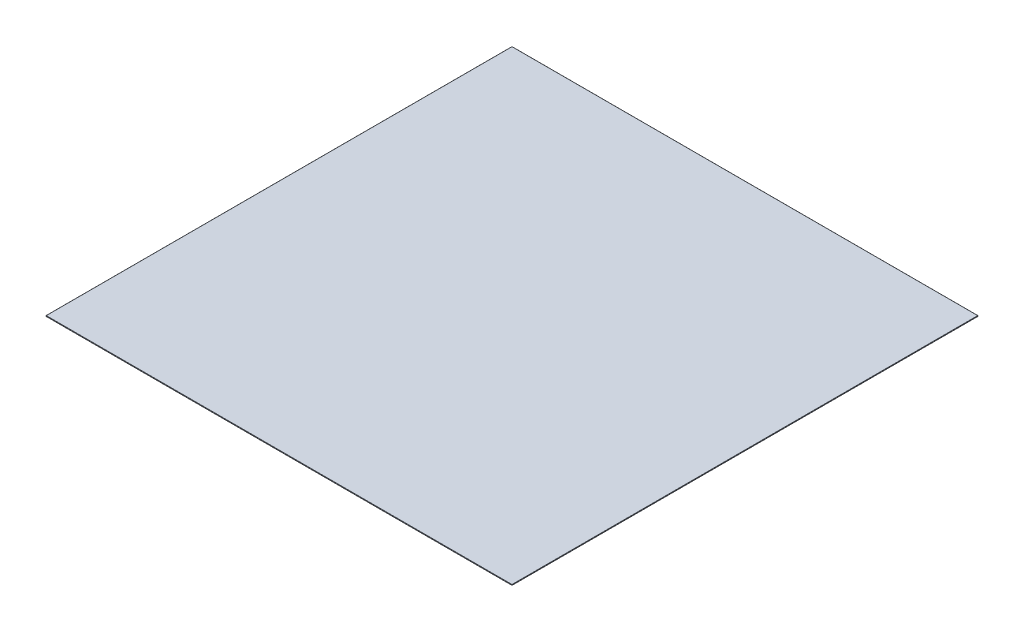
ISO-10303-21;
HEADER;
FILE_DESCRIPTION(('STEP AP214'),'2;1');
FILE_NAME('part.step','',(''),(''),'','','');
FILE_SCHEMA(('AUTOMOTIVE_DESIGN { 1 0 10303 214 1 1 1 1 }'));
ENDSEC;
DATA;
#1=APPLICATION_CONTEXT('core data for automotive mechanical design processes');
#2=APPLICATION_PROTOCOL_DEFINITION('international standard','automotive_design',2000,#1);
#3=PRODUCT_CONTEXT('',#1,'mechanical');
#4=PRODUCT('Part','Part','',(#3));
#5=PRODUCT_RELATED_PRODUCT_CATEGORY('part','',(#4));
#6=PRODUCT_DEFINITION_FORMATION('','',#4);
#7=PRODUCT_DEFINITION_CONTEXT('part definition',#1,'design');
#8=PRODUCT_DEFINITION('design','',#6,#7);
#9=PRODUCT_DEFINITION_SHAPE('','',#8);
#10=(LENGTH_UNIT() NAMED_UNIT(*) SI_UNIT(.MILLI.,.METRE.));
#11=(NAMED_UNIT(*) PLANE_ANGLE_UNIT() SI_UNIT($,.RADIAN.));
#12=(NAMED_UNIT(*) SI_UNIT($,.STERADIAN.) SOLID_ANGLE_UNIT());
#13=UNCERTAINTY_MEASURE_WITH_UNIT(LENGTH_MEASURE(1.E-05),#10,'distance_accuracy_value','');
#14=(GEOMETRIC_REPRESENTATION_CONTEXT(3) GLOBAL_UNCERTAINTY_ASSIGNED_CONTEXT((#13)) GLOBAL_UNIT_ASSIGNED_CONTEXT((#10,
#11,#12)) REPRESENTATION_CONTEXT('',''));
#15=CARTESIAN_POINT('',(0.,0.,0.));
#16=DIRECTION('',(0.,0.,1.));
#17=DIRECTION('',(1.,0.,0.));
#18=AXIS2_PLACEMENT_3D('',#15,#16,#17);
#19=CARTESIAN_POINT('',(0.,3.175,0.));
#20=DIRECTION('',(1.,0.,0.));
#21=DIRECTION('',(0.,0.,-1.));
#22=AXIS2_PLACEMENT_3D('',#19,#20,#21);
#23=PLANE('',#22);
#24=DIRECTION('',(0.,-1.,0.));
#25=VECTOR('',#24,1.);
#26=CARTESIAN_POINT('',(0.,3.175,1999.));
#27=LINE('',#26,#25);
#28=CARTESIAN_POINT('',(0.,1.,1999.));
#29=VERTEX_POINT('',#28);
#30=CARTESIAN_POINT('',(0.,2.175,1999.));
#31=VERTEX_POINT('',#30);
#32=EDGE_CURVE('E133',#29,#31,#27,.F.);
#33=ORIENTED_EDGE('',*,*,#32,.T.);
#34=DIRECTION('',(0.,0.,1.));
#35=VECTOR('',#34,1.);
#36=CARTESIAN_POINT('',(0.,2.175,0.));
#37=LINE('',#36,#35);
#38=CARTESIAN_POINT('',(0.,2.175,1.));
#39=VERTEX_POINT('',#38);
#40=EDGE_CURVE('E170',#31,#39,#37,.F.);
#41=ORIENTED_EDGE('',*,*,#40,.T.);
#42=DIRECTION('',(0.,-1.,0.));
#43=VECTOR('',#42,1.);
#44=CARTESIAN_POINT('',(0.,3.175,1.));
#45=LINE('',#44,#43);
#46=CARTESIAN_POINT('',(0.,1.,1.));
#47=VERTEX_POINT('',#46);
#48=EDGE_CURVE('E167',#39,#47,#45,.T.);
#49=ORIENTED_EDGE('',*,*,#48,.T.);
#50=DIRECTION('',(0.,0.,1.));
#51=VECTOR('',#50,1.);
#52=CARTESIAN_POINT('',(0.,1.,0.));
#53=LINE('',#52,#51);
#54=EDGE_CURVE('E162',#47,#29,#53,.T.);
#55=ORIENTED_EDGE('',*,*,#54,.T.);
#56=EDGE_LOOP('',(#33,#41,#49,#55));
#57=FACE_BOUND('',#56,.T.);
#58=ADVANCED_FACE('F37',(#57),#23,.F.);
#59=CARTESIAN_POINT('',(0.,3.175,2000.));
#60=DIRECTION('',(0.,0.,-1.));
#61=DIRECTION('',(-1.,0.,0.));
#62=AXIS2_PLACEMENT_3D('',#59,#60,#61);
#63=PLANE('',#62);
#64=DIRECTION('',(0.,-1.,0.));
#65=VECTOR('',#64,1.);
#66=CARTESIAN_POINT('',(1999.,3.175,2000.));
#67=LINE('',#66,#65);
#68=CARTESIAN_POINT('',(1999.,1.,2000.));
#69=VERTEX_POINT('',#68);
#70=CARTESIAN_POINT('',(1999.,2.175,2000.));
#71=VERTEX_POINT('',#70);
#72=EDGE_CURVE('E155',#69,#71,#67,.F.);
#73=ORIENTED_EDGE('',*,*,#72,.T.);
#74=DIRECTION('',(1.,0.,0.));
#75=VECTOR('',#74,1.);
#76=CARTESIAN_POINT('',(0.,2.175,2000.));
#77=LINE('',#76,#75);
#78=CARTESIAN_POINT('',(1.,2.175,2000.));
#79=VERTEX_POINT('',#78);
#80=EDGE_CURVE('E159',#71,#79,#77,.F.);
#81=ORIENTED_EDGE('',*,*,#80,.T.);
#82=DIRECTION('',(0.,-1.,0.));
#83=VECTOR('',#82,1.);
#84=CARTESIAN_POINT('',(1.,3.175,2000.));
#85=LINE('',#84,#83);
#86=CARTESIAN_POINT('',(1.,1.,2000.));
#87=VERTEX_POINT('',#86);
#88=EDGE_CURVE('E131',#79,#87,#85,.T.);
#89=ORIENTED_EDGE('',*,*,#88,.T.);
#90=DIRECTION('',(1.,0.,0.));
#91=VECTOR('',#90,1.);
#92=CARTESIAN_POINT('',(0.,1.,2000.));
#93=LINE('',#92,#91);
#94=EDGE_CURVE('E149',#87,#69,#93,.T.);
#95=ORIENTED_EDGE('',*,*,#94,.T.);
#96=EDGE_LOOP('',(#73,#81,#89,#95));
#97=FACE_BOUND('',#96,.T.);
#98=ADVANCED_FACE('F157',(#97),#63,.F.);
#99=CARTESIAN_POINT('',(2000.,3.175,0.));
#100=DIRECTION('',(-1.,0.,0.));
#101=DIRECTION('',(0.,0.,1.));
#102=AXIS2_PLACEMENT_3D('',#99,#100,#101);
#103=PLANE('',#102);
#104=DIRECTION('',(0.,-1.,0.));
#105=VECTOR('',#104,1.);
#106=CARTESIAN_POINT('',(2000.,3.175,1.));
#107=LINE('',#106,#105);
#108=CARTESIAN_POINT('',(2000.,1.,1.));
#109=VERTEX_POINT('',#108);
#110=CARTESIAN_POINT('',(2000.,2.175,1.));
#111=VERTEX_POINT('',#110);
#112=EDGE_CURVE('E174',#109,#111,#107,.F.);
#113=ORIENTED_EDGE('',*,*,#112,.T.);
#114=DIRECTION('',(0.,0.,-1.));
#115=VECTOR('',#114,1.);
#116=CARTESIAN_POINT('',(2000.,2.175,2000.));
#117=LINE('',#116,#115);
#118=CARTESIAN_POINT('',(2000.,2.175,1999.));
#119=VERTEX_POINT('',#118);
#120=EDGE_CURVE('E179',#111,#119,#117,.F.);
#121=ORIENTED_EDGE('',*,*,#120,.T.);
#122=DIRECTION('',(0.,-1.,0.));
#123=VECTOR('',#122,1.);
#124=CARTESIAN_POINT('',(2000.,3.175,1999.));
#125=LINE('',#124,#123);
#126=CARTESIAN_POINT('',(2000.,1.,1999.));
#127=VERTEX_POINT('',#126);
#128=EDGE_CURVE('E176',#119,#127,#125,.T.);
#129=ORIENTED_EDGE('',*,*,#128,.T.);
#130=DIRECTION('',(0.,0.,-1.));
#131=VECTOR('',#130,1.);
#132=CARTESIAN_POINT('',(2000.,1.,0.));
#133=LINE('',#132,#131);
#134=EDGE_CURVE('E172',#127,#109,#133,.T.);
#135=ORIENTED_EDGE('',*,*,#134,.T.);
#136=EDGE_LOOP('',(#113,#121,#129,#135));
#137=FACE_BOUND('',#136,.T.);
#138=ADVANCED_FACE('F284',(#137),#103,.F.);
#139=CARTESIAN_POINT('',(0.,3.175,0.));
#140=DIRECTION('',(0.,0.,1.));
#141=DIRECTION('',(1.,0.,0.));
#142=AXIS2_PLACEMENT_3D('',#139,#140,#141);
#143=PLANE('',#142);
#144=DIRECTION('',(0.,-1.,0.));
#145=VECTOR('',#144,1.);
#146=CARTESIAN_POINT('',(1.,3.175,0.));
#147=LINE('',#146,#145);
#148=CARTESIAN_POINT('',(1.,1.,0.));
#149=VERTEX_POINT('',#148);
#150=CARTESIAN_POINT('',(1.,2.175,0.));
#151=VERTEX_POINT('',#150);
#152=EDGE_CURVE('E183',#149,#151,#147,.F.);
#153=ORIENTED_EDGE('',*,*,#152,.T.);
#154=DIRECTION('',(-1.,0.,0.));
#155=VECTOR('',#154,1.);
#156=CARTESIAN_POINT('',(2000.,2.175,0.));
#157=LINE('',#156,#155);
#158=CARTESIAN_POINT('',(1999.,2.175,0.));
#159=VERTEX_POINT('',#158);
#160=EDGE_CURVE('E188',#151,#159,#157,.F.);
#161=ORIENTED_EDGE('',*,*,#160,.T.);
#162=DIRECTION('',(0.,-1.,0.));
#163=VECTOR('',#162,1.);
#164=CARTESIAN_POINT('',(1999.,3.175,0.));
#165=LINE('',#164,#163);
#166=CARTESIAN_POINT('',(1999.,1.,0.));
#167=VERTEX_POINT('',#166);
#168=EDGE_CURVE('E185',#159,#167,#165,.T.);
#169=ORIENTED_EDGE('',*,*,#168,.T.);
#170=DIRECTION('',(-1.,0.,0.));
#171=VECTOR('',#170,1.);
#172=CARTESIAN_POINT('',(0.,1.,0.));
#173=LINE('',#172,#171);
#174=EDGE_CURVE('E181',#167,#149,#173,.T.);
#175=ORIENTED_EDGE('',*,*,#174,.T.);
#176=EDGE_LOOP('',(#153,#161,#169,#175));
#177=FACE_BOUND('',#176,.T.);
#178=ADVANCED_FACE('F295',(#177),#143,.F.);
#179=CARTESIAN_POINT('',(0.,3.175,0.));
#180=DIRECTION('',(0.,1.,0.));
#181=DIRECTION('',(0.,0.,1.));
#182=AXIS2_PLACEMENT_3D('',#179,#180,#181);
#183=PLANE('',#182);
#184=DIRECTION('',(0.,0.,-1.));
#185=VECTOR('',#184,1.);
#186=CARTESIAN_POINT('',(1999.,3.175,0.));
#187=LINE('',#186,#185);
#188=CARTESIAN_POINT('',(1999.,3.175,1999.));
#189=VERTEX_POINT('',#188);
#190=CARTESIAN_POINT('',(1999.,3.175,1.));
#191=VERTEX_POINT('',#190);
#192=EDGE_CURVE('E194',#189,#191,#187,.T.);
#193=ORIENTED_EDGE('',*,*,#192,.T.);
#194=DIRECTION('',(-1.,0.,0.));
#195=VECTOR('',#194,1.);
#196=CARTESIAN_POINT('',(0.,3.175,1.));
#197=LINE('',#196,#195);
#198=CARTESIAN_POINT('',(1.,3.175,1.));
#199=VERTEX_POINT('',#198);
#200=EDGE_CURVE('E196',#191,#199,#197,.T.);
#201=ORIENTED_EDGE('',*,*,#200,.T.);
#202=DIRECTION('',(0.,0.,1.));
#203=VECTOR('',#202,1.);
#204=CARTESIAN_POINT('',(1.,3.175,2000.));
#205=LINE('',#204,#203);
#206=CARTESIAN_POINT('',(1.,3.175,1999.));
#207=VERTEX_POINT('',#206);
#208=EDGE_CURVE('E190',#199,#207,#205,.T.);
#209=ORIENTED_EDGE('',*,*,#208,.T.);
#210=DIRECTION('',(1.,0.,0.));
#211=VECTOR('',#210,1.);
#212=CARTESIAN_POINT('',(2000.,3.175,1999.));
#213=LINE('',#212,#211);
#214=EDGE_CURVE('E192',#207,#189,#213,.T.);
#215=ORIENTED_EDGE('',*,*,#214,.T.);
#216=EDGE_LOOP('',(#193,#201,#209,#215));
#217=FACE_BOUND('',#216,.T.);
#218=ADVANCED_FACE('F276',(#217),#183,.T.);
#219=CARTESIAN_POINT('',(0.,0.,0.));
#220=DIRECTION('',(0.,1.,0.));
#221=DIRECTION('',(0.,0.,1.));
#222=AXIS2_PLACEMENT_3D('',#219,#220,#221);
#223=PLANE('',#222);
#224=DIRECTION('',(0.,0.,-1.));
#225=VECTOR('',#224,1.);
#226=CARTESIAN_POINT('',(1999.,0.,-4.43867165245138E-13));
#227=LINE('',#226,#225);
#228=CARTESIAN_POINT('',(1999.,0.,1.));
#229=VERTEX_POINT('',#228);
#230=CARTESIAN_POINT('',(1999.,0.,1999.));
#231=VERTEX_POINT('',#230);
#232=EDGE_CURVE('E46',#229,#231,#227,.F.);
#233=ORIENTED_EDGE('',*,*,#232,.T.);
#234=DIRECTION('',(1.,0.,0.));
#235=VECTOR('',#234,1.);
#236=CARTESIAN_POINT('',(0.,0.,1999.));
#237=LINE('',#236,#235);
#238=CARTESIAN_POINT('',(1.,0.,1999.));
#239=VERTEX_POINT('',#238);
#240=EDGE_CURVE('E11',#231,#239,#237,.F.);
#241=ORIENTED_EDGE('',*,*,#240,.T.);
#242=DIRECTION('',(0.,0.,1.));
#243=VECTOR('',#242,1.);
#244=CARTESIAN_POINT('',(1.,0.,0.));
#245=LINE('',#244,#243);
#246=CARTESIAN_POINT('',(1.,0.,1.));
#247=VERTEX_POINT('',#246);
#248=EDGE_CURVE('E199',#239,#247,#245,.F.);
#249=ORIENTED_EDGE('',*,*,#248,.T.);
#250=DIRECTION('',(-1.,0.,0.));
#251=VECTOR('',#250,1.);
#252=CARTESIAN_POINT('',(0.,0.,1.));
#253=LINE('',#252,#251);
#254=EDGE_CURVE('E57',#247,#229,#253,.F.);
#255=ORIENTED_EDGE('',*,*,#254,.T.);
#256=EDGE_LOOP('',(#233,#241,#249,#255));
#257=FACE_BOUND('',#256,.T.);
#258=ADVANCED_FACE('F482',(#257),#223,.F.);
#259=CARTESIAN_POINT('',(1999.,3.175,1.));
#260=DIRECTION('',(0.,-1.,0.));
#261=DIRECTION('',(0.,0.,-1.));
#262=AXIS2_PLACEMENT_3D('',#259,#260,#261);
#263=CYLINDRICAL_SURFACE('',#262,1.);
#264=CARTESIAN_POINT('',(1999.,2.175,1.));
#265=DIRECTION('',(0.,1.,0.));
#266=DIRECTION('',(0.,0.,1.));
#267=AXIS2_PLACEMENT_3D('',#264,#265,#266);
#268=CIRCLE('',#267,1.);
#269=EDGE_CURVE('E41',#111,#159,#268,.T.);
#270=ORIENTED_EDGE('',*,*,#269,.F.);
#271=ORIENTED_EDGE('',*,*,#112,.F.);
#272=CARTESIAN_POINT('',(1999.,1.,1.));
#273=DIRECTION('',(0.,-1.,0.));
#274=DIRECTION('',(0.,0.,-1.));
#275=AXIS2_PLACEMENT_3D('',#272,#273,#274);
#276=CIRCLE('',#275,1.);
#277=EDGE_CURVE('E253',#167,#109,#276,.T.);
#278=ORIENTED_EDGE('',*,*,#277,.F.);
#279=ORIENTED_EDGE('',*,*,#168,.F.);
#280=EDGE_LOOP('',(#270,#271,#278,#279));
#281=FACE_BOUND('',#280,.T.);
#282=ADVANCED_FACE('F39',(#281),#263,.T.);
#283=CARTESIAN_POINT('',(1999.,2.175,1.));
#284=DIRECTION('',(0.,0.,1.));
#285=DIRECTION('',(1.,0.,0.));
#286=AXIS2_PLACEMENT_3D('',#283,#284,#285);
#287=SPHERICAL_SURFACE('',#286,1.);
#288=CARTESIAN_POINT('',(1999.,2.175,1.));
#289=DIRECTION('',(0.,0.,-1.));
#290=DIRECTION('',(-1.,0.,0.));
#291=AXIS2_PLACEMENT_3D('',#288,#289,#290);
#292=CIRCLE('',#291,1.);
#293=EDGE_CURVE('E248',#111,#191,#292,.F.);
#294=ORIENTED_EDGE('',*,*,#293,.F.);
#295=ORIENTED_EDGE('',*,*,#269,.T.);
#296=CARTESIAN_POINT('',(1999.,2.175,1.));
#297=DIRECTION('',(1.,0.,0.));
#298=DIRECTION('',(0.,0.,-1.));
#299=AXIS2_PLACEMENT_3D('',#296,#297,#298);
#300=CIRCLE('',#299,1.);
#301=EDGE_CURVE('E251',#191,#159,#300,.F.);
#302=ORIENTED_EDGE('',*,*,#301,.F.);
#303=EDGE_LOOP('',(#294,#295,#302));
#304=FACE_BOUND('',#303,.T.);
#305=ADVANCED_FACE('F264',(#304),#287,.T.);
#306=CARTESIAN_POINT('',(1999.,1.,1.));
#307=DIRECTION('',(0.,0.,1.));
#308=DIRECTION('',(1.,0.,0.));
#309=AXIS2_PLACEMENT_3D('',#306,#307,#308);
#310=SPHERICAL_SURFACE('',#309,1.);
#311=CARTESIAN_POINT('',(1999.,1.,1.));
#312=DIRECTION('',(1.,0.,0.));
#313=DIRECTION('',(0.,0.,-1.));
#314=AXIS2_PLACEMENT_3D('',#311,#312,#313);
#315=CIRCLE('',#314,1.);
#316=EDGE_CURVE('E243',#167,#229,#315,.F.);
#317=ORIENTED_EDGE('',*,*,#316,.F.);
#318=ORIENTED_EDGE('',*,*,#277,.T.);
#319=CARTESIAN_POINT('',(1999.,1.,1.));
#320=DIRECTION('',(0.,0.,-1.));
#321=DIRECTION('',(-1.,0.,0.));
#322=AXIS2_PLACEMENT_3D('',#319,#320,#321);
#323=CIRCLE('',#322,1.);
#324=EDGE_CURVE('E245',#229,#109,#323,.F.);
#325=ORIENTED_EDGE('',*,*,#324,.F.);
#326=EDGE_LOOP('',(#317,#318,#325));
#327=FACE_BOUND('',#326,.T.);
#328=ADVANCED_FACE('F461',(#327),#310,.T.);
#329=CARTESIAN_POINT('',(0.,2.175,1.));
#330=DIRECTION('',(1.,0.,0.));
#331=DIRECTION('',(0.,0.,-1.));
#332=AXIS2_PLACEMENT_3D('',#329,#330,#331);
#333=CYLINDRICAL_SURFACE('',#332,1.);
#334=ORIENTED_EDGE('',*,*,#301,.T.);
#335=ORIENTED_EDGE('',*,*,#160,.F.);
#336=CARTESIAN_POINT('',(1.,2.175,1.));
#337=DIRECTION('',(-1.,0.,0.));
#338=DIRECTION('',(0.,0.,1.));
#339=AXIS2_PLACEMENT_3D('',#336,#337,#338);
#340=CIRCLE('',#339,1.);
#341=EDGE_CURVE('E237',#199,#151,#340,.T.);
#342=ORIENTED_EDGE('',*,*,#341,.F.);
#343=ORIENTED_EDGE('',*,*,#200,.F.);
#344=EDGE_LOOP('',(#334,#335,#342,#343));
#345=FACE_BOUND('',#344,.T.);
#346=ADVANCED_FACE('F272',(#345),#333,.T.);
#347=CARTESIAN_POINT('',(1999.,2.175,-4.43867165245138E-13));
#348=DIRECTION('',(0.,0.,1.));
#349=DIRECTION('',(1.,0.,0.));
#350=AXIS2_PLACEMENT_3D('',#347,#348,#349);
#351=CYLINDRICAL_SURFACE('',#350,1.);
#352=ORIENTED_EDGE('',*,*,#293,.T.);
#353=ORIENTED_EDGE('',*,*,#192,.F.);
#354=CARTESIAN_POINT('',(1999.,2.175,1999.));
#355=DIRECTION('',(0.,0.,1.));
#356=DIRECTION('',(1.,0.,0.));
#357=AXIS2_PLACEMENT_3D('',#354,#355,#356);
#358=CIRCLE('',#357,1.);
#359=EDGE_CURVE('E234',#119,#189,#358,.T.);
#360=ORIENTED_EDGE('',*,*,#359,.F.);
#361=ORIENTED_EDGE('',*,*,#120,.F.);
#362=EDGE_LOOP('',(#352,#353,#360,#361));
#363=FACE_BOUND('',#362,.T.);
#364=ADVANCED_FACE('F281',(#363),#351,.T.);
#365=CARTESIAN_POINT('',(1999.,3.175,1999.));
#366=DIRECTION('',(0.,-1.,0.));
#367=DIRECTION('',(0.,0.,-1.));
#368=AXIS2_PLACEMENT_3D('',#365,#366,#367);
#369=CYLINDRICAL_SURFACE('',#368,1.);
#370=CARTESIAN_POINT('',(1999.,1.,1999.));
#371=DIRECTION('',(0.,-1.,0.));
#372=DIRECTION('',(0.,0.,-1.));
#373=AXIS2_PLACEMENT_3D('',#370,#371,#372);
#374=CIRCLE('',#373,1.);
#375=EDGE_CURVE('E228',#127,#69,#374,.T.);
#376=ORIENTED_EDGE('',*,*,#375,.F.);
#377=ORIENTED_EDGE('',*,*,#128,.F.);
#378=CARTESIAN_POINT('',(1999.,2.175,1999.));
#379=DIRECTION('',(0.,1.,0.));
#380=DIRECTION('',(0.,0.,1.));
#381=AXIS2_PLACEMENT_3D('',#378,#379,#380);
#382=CIRCLE('',#381,1.);
#383=EDGE_CURVE('E231',#71,#119,#382,.T.);
#384=ORIENTED_EDGE('',*,*,#383,.F.);
#385=ORIENTED_EDGE('',*,*,#72,.F.);
#386=EDGE_LOOP('',(#376,#377,#384,#385));
#387=FACE_BOUND('',#386,.T.);
#388=ADVANCED_FACE('F288',(#387),#369,.T.);
#389=CARTESIAN_POINT('',(1999.,1.,0.));
#390=DIRECTION('',(0.,0.,-1.));
#391=DIRECTION('',(-1.,0.,0.));
#392=AXIS2_PLACEMENT_3D('',#389,#390,#391);
#393=CYLINDRICAL_SURFACE('',#392,1.);
#394=ORIENTED_EDGE('',*,*,#324,.T.);
#395=ORIENTED_EDGE('',*,*,#134,.F.);
#396=CARTESIAN_POINT('',(1999.,1.,1999.));
#397=DIRECTION('',(0.,0.,1.));
#398=DIRECTION('',(1.,0.,0.));
#399=AXIS2_PLACEMENT_3D('',#396,#397,#398);
#400=CIRCLE('',#399,1.);
#401=EDGE_CURVE('E226',#231,#127,#400,.T.);
#402=ORIENTED_EDGE('',*,*,#401,.F.);
#403=ORIENTED_EDGE('',*,*,#232,.F.);
#404=EDGE_LOOP('',(#394,#395,#402,#403));
#405=FACE_BOUND('',#404,.T.);
#406=ADVANCED_FACE('F293',(#405),#393,.T.);
#407=CARTESIAN_POINT('',(0.,1.,1.));
#408=DIRECTION('',(-1.,0.,0.));
#409=DIRECTION('',(0.,0.,1.));
#410=AXIS2_PLACEMENT_3D('',#407,#408,#409);
#411=CYLINDRICAL_SURFACE('',#410,1.);
#412=ORIENTED_EDGE('',*,*,#316,.T.);
#413=ORIENTED_EDGE('',*,*,#254,.F.);
#414=CARTESIAN_POINT('',(1.,1.,1.));
#415=DIRECTION('',(-1.,0.,0.));
#416=DIRECTION('',(0.,0.,1.));
#417=AXIS2_PLACEMENT_3D('',#414,#415,#416);
#418=CIRCLE('',#417,1.);
#419=EDGE_CURVE('E223',#149,#247,#418,.T.);
#420=ORIENTED_EDGE('',*,*,#419,.F.);
#421=ORIENTED_EDGE('',*,*,#174,.F.);
#422=EDGE_LOOP('',(#412,#413,#420,#421));
#423=FACE_BOUND('',#422,.T.);
#424=ADVANCED_FACE('F304',(#423),#411,.T.);
#425=CARTESIAN_POINT('',(1.,3.175,1.));
#426=DIRECTION('',(0.,-1.,0.));
#427=DIRECTION('',(0.,0.,-1.));
#428=AXIS2_PLACEMENT_3D('',#425,#426,#427);
#429=CYLINDRICAL_SURFACE('',#428,1.);
#430=CARTESIAN_POINT('',(1.,2.175,1.));
#431=DIRECTION('',(0.,1.,0.));
#432=DIRECTION('',(0.,0.,1.));
#433=AXIS2_PLACEMENT_3D('',#430,#431,#432);
#434=CIRCLE('',#433,1.);
#435=EDGE_CURVE('E240',#151,#39,#434,.T.);
#436=ORIENTED_EDGE('',*,*,#435,.F.);
#437=ORIENTED_EDGE('',*,*,#152,.F.);
#438=CARTESIAN_POINT('',(1.,1.,1.));
#439=DIRECTION('',(0.,-1.,0.));
#440=DIRECTION('',(0.,0.,-1.));
#441=AXIS2_PLACEMENT_3D('',#438,#439,#440);
#442=CIRCLE('',#441,1.);
#443=EDGE_CURVE('E220',#47,#149,#442,.T.);
#444=ORIENTED_EDGE('',*,*,#443,.F.);
#445=ORIENTED_EDGE('',*,*,#48,.F.);
#446=EDGE_LOOP('',(#436,#437,#444,#445));
#447=FACE_BOUND('',#446,.T.);
#448=ADVANCED_FACE('F300',(#447),#429,.T.);
#449=CARTESIAN_POINT('',(1.,2.175,1.));
#450=DIRECTION('',(0.,0.,1.));
#451=DIRECTION('',(1.,0.,0.));
#452=AXIS2_PLACEMENT_3D('',#449,#450,#451);
#453=SPHERICAL_SURFACE('',#452,1.);
#454=ORIENTED_EDGE('',*,*,#341,.T.);
#455=ORIENTED_EDGE('',*,*,#435,.T.);
#456=CARTESIAN_POINT('',(1.,2.175,1.));
#457=DIRECTION('',(0.,0.,-1.));
#458=DIRECTION('',(-1.,0.,0.));
#459=AXIS2_PLACEMENT_3D('',#456,#457,#458);
#460=CIRCLE('',#459,1.);
#461=EDGE_CURVE('E217',#199,#39,#460,.F.);
#462=ORIENTED_EDGE('',*,*,#461,.F.);
#463=EDGE_LOOP('',(#454,#455,#462));
#464=FACE_BOUND('',#463,.T.);
#465=ADVANCED_FACE('F314',(#464),#453,.T.);
#466=CARTESIAN_POINT('',(1999.,2.175,1999.));
#467=DIRECTION('',(0.,0.,1.));
#468=DIRECTION('',(1.,0.,0.));
#469=AXIS2_PLACEMENT_3D('',#466,#467,#468);
#470=SPHERICAL_SURFACE('',#469,1.);
#471=ORIENTED_EDGE('',*,*,#383,.T.);
#472=ORIENTED_EDGE('',*,*,#359,.T.);
#473=CARTESIAN_POINT('',(1999.,2.175,1999.));
#474=DIRECTION('',(1.,0.,0.));
#475=DIRECTION('',(0.,0.,-1.));
#476=AXIS2_PLACEMENT_3D('',#473,#474,#475);
#477=CIRCLE('',#476,1.);
#478=EDGE_CURVE('E214',#71,#189,#477,.F.);
#479=ORIENTED_EDGE('',*,*,#478,.F.);
#480=EDGE_LOOP('',(#471,#472,#479));
#481=FACE_BOUND('',#480,.T.);
#482=ADVANCED_FACE('F324',(#481),#470,.T.);
#483=CARTESIAN_POINT('',(1999.,1.,1999.));
#484=DIRECTION('',(0.,0.,1.));
#485=DIRECTION('',(1.,0.,0.));
#486=AXIS2_PLACEMENT_3D('',#483,#484,#485);
#487=SPHERICAL_SURFACE('',#486,1.);
#488=ORIENTED_EDGE('',*,*,#401,.T.);
#489=ORIENTED_EDGE('',*,*,#375,.T.);
#490=CARTESIAN_POINT('',(1999.,1.,1999.));
#491=DIRECTION('',(1.,0.,0.));
#492=DIRECTION('',(0.,0.,-1.));
#493=AXIS2_PLACEMENT_3D('',#490,#491,#492);
#494=CIRCLE('',#493,1.);
#495=EDGE_CURVE('E152',#231,#69,#494,.F.);
#496=ORIENTED_EDGE('',*,*,#495,.F.);
#497=EDGE_LOOP('',(#488,#489,#496));
#498=FACE_BOUND('',#497,.T.);
#499=ADVANCED_FACE('F326',(#498),#487,.T.);
#500=CARTESIAN_POINT('',(1.,1.,1.));
#501=DIRECTION('',(0.,0.,1.));
#502=DIRECTION('',(1.,0.,0.));
#503=AXIS2_PLACEMENT_3D('',#500,#501,#502);
#504=SPHERICAL_SURFACE('',#503,1.);
#505=ORIENTED_EDGE('',*,*,#443,.T.);
#506=ORIENTED_EDGE('',*,*,#419,.T.);
#507=CARTESIAN_POINT('',(1.,1.,1.));
#508=DIRECTION('',(0.,0.,-1.));
#509=DIRECTION('',(-1.,0.,0.));
#510=AXIS2_PLACEMENT_3D('',#507,#508,#509);
#511=CIRCLE('',#510,1.);
#512=EDGE_CURVE('E210',#47,#247,#511,.F.);
#513=ORIENTED_EDGE('',*,*,#512,.F.);
#514=EDGE_LOOP('',(#505,#506,#513));
#515=FACE_BOUND('',#514,.T.);
#516=ADVANCED_FACE('F306',(#515),#504,.T.);
#517=CARTESIAN_POINT('',(1.,2.175,0.));
#518=DIRECTION('',(0.,0.,-1.));
#519=DIRECTION('',(-1.,0.,0.));
#520=AXIS2_PLACEMENT_3D('',#517,#518,#519);
#521=CYLINDRICAL_SURFACE('',#520,1.);
#522=ORIENTED_EDGE('',*,*,#461,.T.);
#523=ORIENTED_EDGE('',*,*,#40,.F.);
#524=CARTESIAN_POINT('',(1.,2.175,1999.));
#525=DIRECTION('',(0.,0.,1.));
#526=DIRECTION('',(1.,0.,0.));
#527=AXIS2_PLACEMENT_3D('',#524,#525,#526);
#528=CIRCLE('',#527,1.);
#529=EDGE_CURVE('E207',#207,#31,#528,.T.);
#530=ORIENTED_EDGE('',*,*,#529,.F.);
#531=ORIENTED_EDGE('',*,*,#208,.F.);
#532=EDGE_LOOP('',(#522,#523,#530,#531));
#533=FACE_BOUND('',#532,.T.);
#534=ADVANCED_FACE('F316',(#533),#521,.T.);
#535=CARTESIAN_POINT('',(0.,2.175,1999.));
#536=DIRECTION('',(-1.,0.,0.));
#537=DIRECTION('',(0.,0.,1.));
#538=AXIS2_PLACEMENT_3D('',#535,#536,#537);
#539=CYLINDRICAL_SURFACE('',#538,1.);
#540=ORIENTED_EDGE('',*,*,#478,.T.);
#541=ORIENTED_EDGE('',*,*,#214,.F.);
#542=CARTESIAN_POINT('',(1.,2.175,1999.));
#543=DIRECTION('',(-1.,0.,0.));
#544=DIRECTION('',(0.,0.,1.));
#545=AXIS2_PLACEMENT_3D('',#542,#543,#544);
#546=CIRCLE('',#545,1.);
#547=EDGE_CURVE('E146',#79,#207,#546,.T.);
#548=ORIENTED_EDGE('',*,*,#547,.F.);
#549=ORIENTED_EDGE('',*,*,#80,.F.);
#550=EDGE_LOOP('',(#540,#541,#548,#549));
#551=FACE_BOUND('',#550,.T.);
#552=ADVANCED_FACE('F322',(#551),#539,.T.);
#553=CARTESIAN_POINT('',(0.,1.,1999.));
#554=DIRECTION('',(1.,0.,0.));
#555=DIRECTION('',(0.,0.,-1.));
#556=AXIS2_PLACEMENT_3D('',#553,#554,#555);
#557=CYLINDRICAL_SURFACE('',#556,1.);
#558=ORIENTED_EDGE('',*,*,#495,.T.);
#559=ORIENTED_EDGE('',*,*,#94,.F.);
#560=CARTESIAN_POINT('',(1.,1.,1999.));
#561=DIRECTION('',(-1.,0.,0.));
#562=DIRECTION('',(0.,0.,1.));
#563=AXIS2_PLACEMENT_3D('',#560,#561,#562);
#564=CIRCLE('',#563,1.);
#565=EDGE_CURVE('E138',#239,#87,#564,.T.);
#566=ORIENTED_EDGE('',*,*,#565,.F.);
#567=ORIENTED_EDGE('',*,*,#240,.F.);
#568=EDGE_LOOP('',(#558,#559,#566,#567));
#569=FACE_BOUND('',#568,.T.);
#570=ADVANCED_FACE('F150',(#569),#557,.T.);
#571=CARTESIAN_POINT('',(1.,1.,0.));
#572=DIRECTION('',(0.,0.,1.));
#573=DIRECTION('',(1.,0.,0.));
#574=AXIS2_PLACEMENT_3D('',#571,#572,#573);
#575=CYLINDRICAL_SURFACE('',#574,1.);
#576=ORIENTED_EDGE('',*,*,#512,.T.);
#577=ORIENTED_EDGE('',*,*,#248,.F.);
#578=CARTESIAN_POINT('',(1.,1.,1999.));
#579=DIRECTION('',(0.,0.,1.));
#580=DIRECTION('',(1.,0.,0.));
#581=AXIS2_PLACEMENT_3D('',#578,#579,#580);
#582=CIRCLE('',#581,1.);
#583=EDGE_CURVE('E142',#29,#239,#582,.T.);
#584=ORIENTED_EDGE('',*,*,#583,.F.);
#585=ORIENTED_EDGE('',*,*,#54,.F.);
#586=EDGE_LOOP('',(#576,#577,#584,#585));
#587=FACE_BOUND('',#586,.T.);
#588=ADVANCED_FACE('F309',(#587),#575,.T.);
#589=CARTESIAN_POINT('',(1.,2.175,1999.));
#590=DIRECTION('',(0.,0.,1.));
#591=DIRECTION('',(1.,0.,0.));
#592=AXIS2_PLACEMENT_3D('',#589,#590,#591);
#593=SPHERICAL_SURFACE('',#592,1.);
#594=ORIENTED_EDGE('',*,*,#547,.T.);
#595=ORIENTED_EDGE('',*,*,#529,.T.);
#596=CARTESIAN_POINT('',(1.,2.175,1999.));
#597=DIRECTION('',(0.,1.,0.));
#598=DIRECTION('',(0.,0.,1.));
#599=AXIS2_PLACEMENT_3D('',#596,#597,#598);
#600=CIRCLE('',#599,1.);
#601=EDGE_CURVE('E135',#79,#31,#600,.F.);
#602=ORIENTED_EDGE('',*,*,#601,.F.);
#603=EDGE_LOOP('',(#594,#595,#602));
#604=FACE_BOUND('',#603,.T.);
#605=ADVANCED_FACE('F320',(#604),#593,.T.);
#606=CARTESIAN_POINT('',(1.,1.,1999.));
#607=DIRECTION('',(0.,0.,1.));
#608=DIRECTION('',(1.,0.,0.));
#609=AXIS2_PLACEMENT_3D('',#606,#607,#608);
#610=SPHERICAL_SURFACE('',#609,1.);
#611=ORIENTED_EDGE('',*,*,#583,.T.);
#612=ORIENTED_EDGE('',*,*,#565,.T.);
#613=CARTESIAN_POINT('',(1.,1.,1999.));
#614=DIRECTION('',(0.,-1.,0.));
#615=DIRECTION('',(0.,0.,-1.));
#616=AXIS2_PLACEMENT_3D('',#613,#614,#615);
#617=CIRCLE('',#616,1.);
#618=EDGE_CURVE('E127',#29,#87,#617,.F.);
#619=ORIENTED_EDGE('',*,*,#618,.F.);
#620=EDGE_LOOP('',(#611,#612,#619));
#621=FACE_BOUND('',#620,.T.);
#622=ADVANCED_FACE('F140',(#621),#610,.T.);
#623=CARTESIAN_POINT('',(1.,3.175,1999.));
#624=DIRECTION('',(0.,-1.,0.));
#625=DIRECTION('',(0.,0.,-1.));
#626=AXIS2_PLACEMENT_3D('',#623,#624,#625);
#627=CYLINDRICAL_SURFACE('',#626,1.);
#628=ORIENTED_EDGE('',*,*,#601,.T.);
#629=ORIENTED_EDGE('',*,*,#32,.F.);
#630=ORIENTED_EDGE('',*,*,#618,.T.);
#631=ORIENTED_EDGE('',*,*,#88,.F.);
#632=EDGE_LOOP('',(#628,#629,#630,#631));
#633=FACE_BOUND('',#632,.T.);
#634=ADVANCED_FACE('F129',(#633),#627,.T.);
#635=CLOSED_SHELL('',(#58,#98,#138,#178,#218,#258,#282,#305,#328,#346,#364,#388,#406,#424,#448,
#465,#482,#499,#516,#534,#552,#570,#588,#605,#622,#634));
#636=MANIFOLD_SOLID_BREP('B2',#635);
#637=ADVANCED_BREP_SHAPE_REPRESENTATION('',(#18,#636),#14);
#638=SHAPE_DEFINITION_REPRESENTATION(#9,#637);
ENDSEC;
END-ISO-10303-21;
